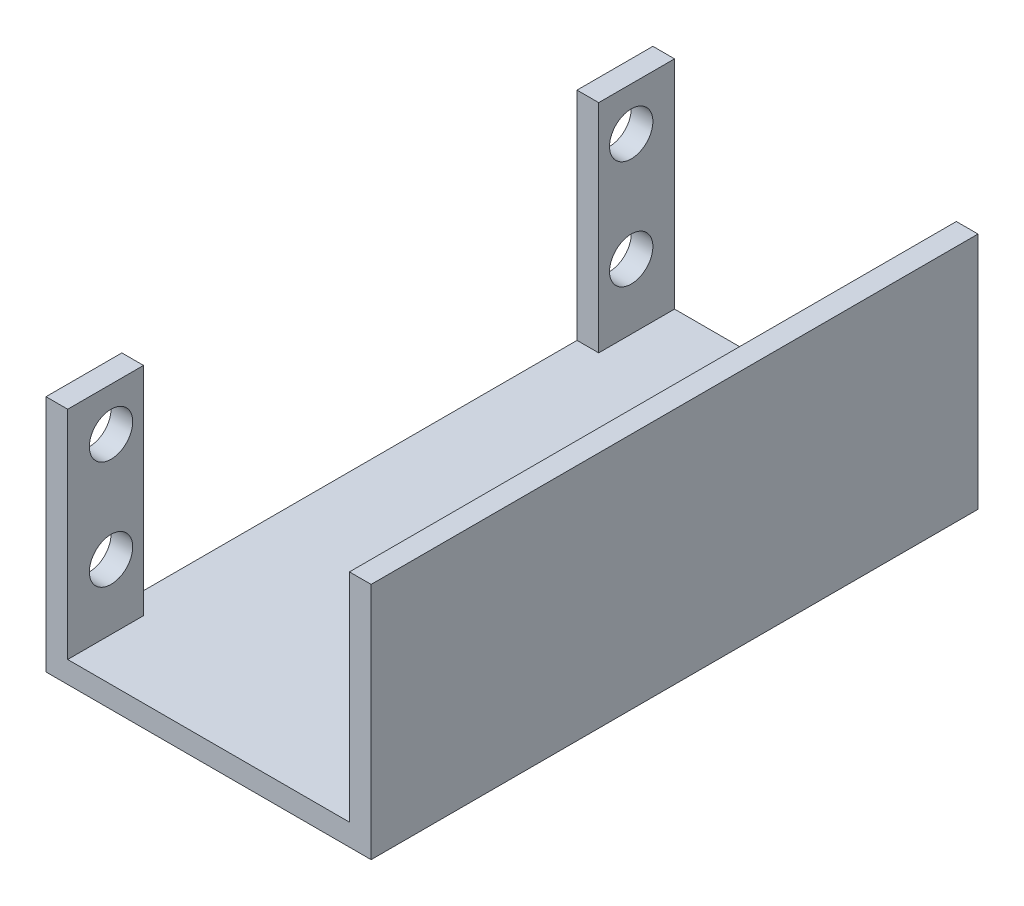
ISO-10303-21;
HEADER;
FILE_DESCRIPTION(('STEP AP214'),'2;1');
FILE_NAME('part.step','',(''),(''),'','','');
FILE_SCHEMA(('AUTOMOTIVE_DESIGN { 1 0 10303 214 1 1 1 1 }'));
ENDSEC;
DATA;
#1=APPLICATION_CONTEXT('core data for automotive mechanical design processes');
#2=APPLICATION_PROTOCOL_DEFINITION('international standard','automotive_design',2000,#1);
#3=PRODUCT_CONTEXT('',#1,'mechanical');
#4=PRODUCT('Part','Part','',(#3));
#5=PRODUCT_RELATED_PRODUCT_CATEGORY('part','',(#4));
#6=PRODUCT_DEFINITION_FORMATION('','',#4);
#7=PRODUCT_DEFINITION_CONTEXT('part definition',#1,'design');
#8=PRODUCT_DEFINITION('design','',#6,#7);
#9=PRODUCT_DEFINITION_SHAPE('','',#8);
#10=(LENGTH_UNIT() NAMED_UNIT(*) SI_UNIT(.MILLI.,.METRE.));
#11=(NAMED_UNIT(*) PLANE_ANGLE_UNIT() SI_UNIT($,.RADIAN.));
#12=(NAMED_UNIT(*) SI_UNIT($,.STERADIAN.) SOLID_ANGLE_UNIT());
#13=UNCERTAINTY_MEASURE_WITH_UNIT(LENGTH_MEASURE(1.E-05),#10,'distance_accuracy_value','');
#14=(GEOMETRIC_REPRESENTATION_CONTEXT(3) GLOBAL_UNCERTAINTY_ASSIGNED_CONTEXT((#13)) GLOBAL_UNIT_ASSIGNED_CONTEXT((#10,
#11,#12)) REPRESENTATION_CONTEXT('',''));
#15=CARTESIAN_POINT('',(0.,0.,0.));
#16=DIRECTION('',(0.,0.,1.));
#17=DIRECTION('',(1.,0.,0.));
#18=AXIS2_PLACEMENT_3D('',#15,#16,#17);
#19=CARTESIAN_POINT('',(-13.,0.,28.));
#20=DIRECTION('',(-1.,0.,0.));
#21=DIRECTION('',(0.,0.,1.));
#22=AXIS2_PLACEMENT_3D('',#19,#20,#21);
#23=PLANE('',#22);
#24=CARTESIAN_POINT('',(-13.,7.,24.));
#25=DIRECTION('',(-1.,0.,0.));
#26=DIRECTION('',(0.,0.,1.));
#27=AXIS2_PLACEMENT_3D('',#24,#25,#26);
#28=CIRCLE('',#27,2.);
#29=CARTESIAN_POINT('',(-13.,7.,26.));
#30=VERTEX_POINT('',#29);
#31=EDGE_CURVE('E239',#30,#30,#28,.F.);
#32=ORIENTED_EDGE('',*,*,#31,.F.);
#33=EDGE_LOOP('',(#32));
#34=FACE_BOUND('',#33,.T.);
#35=CARTESIAN_POINT('',(-13.,17.,24.));
#36=DIRECTION('',(-1.,0.,0.));
#37=DIRECTION('',(0.,0.,1.));
#38=AXIS2_PLACEMENT_3D('',#35,#36,#37);
#39=CIRCLE('',#38,2.00000000000001);
#40=CARTESIAN_POINT('',(-13.,17.,26.));
#41=VERTEX_POINT('',#40);
#42=EDGE_CURVE('E233',#41,#41,#39,.F.);
#43=ORIENTED_EDGE('',*,*,#42,.F.);
#44=EDGE_LOOP('',(#43));
#45=FACE_BOUND('',#44,.T.);
#46=DIRECTION('',(0.,0.,-1.));
#47=VECTOR('',#46,1.);
#48=CARTESIAN_POINT('',(-13.,1.,28.));
#49=LINE('',#48,#47);
#50=CARTESIAN_POINT('',(-13.,1.,28.));
#51=VERTEX_POINT('',#50);
#52=CARTESIAN_POINT('',(-13.,1.,21.));
#53=VERTEX_POINT('',#52);
#54=EDGE_CURVE('E118',#51,#53,#49,.T.);
#55=ORIENTED_EDGE('',*,*,#54,.T.);
#56=DIRECTION('',(0.,1.,0.));
#57=VECTOR('',#56,1.);
#58=CARTESIAN_POINT('',(-13.,0.,21.));
#59=LINE('',#58,#57);
#60=CARTESIAN_POINT('',(-13.,21.,21.));
#61=VERTEX_POINT('',#60);
#62=EDGE_CURVE('E154',#53,#61,#59,.T.);
#63=ORIENTED_EDGE('',*,*,#62,.T.);
#64=DIRECTION('',(0.,0.,-1.));
#65=VECTOR('',#64,1.);
#66=CARTESIAN_POINT('',(-13.,21.,28.));
#67=LINE('',#66,#65);
#68=CARTESIAN_POINT('',(-13.,21.,28.));
#69=VERTEX_POINT('',#68);
#70=EDGE_CURVE('E135',#69,#61,#67,.T.);
#71=ORIENTED_EDGE('',*,*,#70,.F.);
#72=DIRECTION('',(0.,1.,0.));
#73=VECTOR('',#72,1.);
#74=CARTESIAN_POINT('',(-13.,0.,28.));
#75=LINE('',#74,#73);
#76=EDGE_CURVE('E133',#51,#69,#75,.T.);
#77=ORIENTED_EDGE('',*,*,#76,.F.);
#78=EDGE_LOOP('',(#55,#63,#71,#77));
#79=FACE_BOUND('',#78,.T.);
#80=ADVANCED_FACE('F36',(#34,#45,#79),#23,.F.);
#81=CARTESIAN_POINT('',(0.,21.,28.));
#82=DIRECTION('',(0.,1.,0.));
#83=DIRECTION('',(0.,0.,1.));
#84=AXIS2_PLACEMENT_3D('',#81,#82,#83);
#85=PLANE('',#84);
#86=DIRECTION('',(1.,0.,0.));
#87=VECTOR('',#86,1.);
#88=CARTESIAN_POINT('',(-15.,21.,21.));
#89=LINE('',#88,#87);
#90=CARTESIAN_POINT('',(-15.,21.,21.));
#91=VERTEX_POINT('',#90);
#92=EDGE_CURVE('E207',#91,#61,#89,.T.);
#93=ORIENTED_EDGE('',*,*,#92,.F.);
#94=DIRECTION('',(0.,0.,-1.));
#95=VECTOR('',#94,1.);
#96=CARTESIAN_POINT('',(-15.,21.,28.));
#97=LINE('',#96,#95);
#98=CARTESIAN_POINT('',(-15.,21.,28.));
#99=VERTEX_POINT('',#98);
#100=EDGE_CURVE('E60',#99,#91,#97,.T.);
#101=ORIENTED_EDGE('',*,*,#100,.F.);
#102=DIRECTION('',(1.,0.,0.));
#103=VECTOR('',#102,1.);
#104=CARTESIAN_POINT('',(0.,21.,28.));
#105=LINE('',#104,#103);
#106=EDGE_CURVE('E138',#99,#69,#105,.T.);
#107=ORIENTED_EDGE('',*,*,#106,.T.);
#108=ORIENTED_EDGE('',*,*,#70,.T.);
#109=EDGE_LOOP('',(#93,#101,#107,#108));
#110=FACE_BOUND('',#109,.T.);
#111=ADVANCED_FACE('F254',(#110),#85,.T.);
#112=CARTESIAN_POINT('',(-15.,0.,28.));
#113=DIRECTION('',(-1.,0.,0.));
#114=DIRECTION('',(0.,0.,1.));
#115=AXIS2_PLACEMENT_3D('',#112,#113,#114);
#116=PLANE('',#115);
#117=CARTESIAN_POINT('',(-15.,7.,-24.));
#118=DIRECTION('',(-1.,0.,0.));
#119=DIRECTION('',(0.,0.,1.));
#120=AXIS2_PLACEMENT_3D('',#117,#118,#119);
#121=CIRCLE('',#120,2.);
#122=CARTESIAN_POINT('',(-15.,7.,-22.));
#123=VERTEX_POINT('',#122);
#124=EDGE_CURVE('E242',#123,#123,#121,.T.);
#125=ORIENTED_EDGE('',*,*,#124,.F.);
#126=EDGE_LOOP('',(#125));
#127=FACE_BOUND('',#126,.T.);
#128=CARTESIAN_POINT('',(-15.,7.,24.));
#129=DIRECTION('',(-1.,0.,0.));
#130=DIRECTION('',(0.,0.,-1.));
#131=AXIS2_PLACEMENT_3D('',#128,#129,#130);
#132=CIRCLE('',#131,2.);
#133=CARTESIAN_POINT('',(-15.,7.,22.));
#134=VERTEX_POINT('',#133);
#135=EDGE_CURVE('E236',#134,#134,#132,.T.);
#136=ORIENTED_EDGE('',*,*,#135,.F.);
#137=EDGE_LOOP('',(#136));
#138=FACE_BOUND('',#137,.T.);
#139=CARTESIAN_POINT('',(-15.,17.,24.));
#140=DIRECTION('',(-1.,0.,0.));
#141=DIRECTION('',(0.,0.,-1.));
#142=AXIS2_PLACEMENT_3D('',#139,#140,#141);
#143=CIRCLE('',#142,2.00000000000001);
#144=CARTESIAN_POINT('',(-15.,17.,22.));
#145=VERTEX_POINT('',#144);
#146=EDGE_CURVE('E230',#145,#145,#143,.T.);
#147=ORIENTED_EDGE('',*,*,#146,.F.);
#148=EDGE_LOOP('',(#147));
#149=FACE_BOUND('',#148,.T.);
#150=CARTESIAN_POINT('',(-15.,17.,-24.));
#151=DIRECTION('',(-1.,0.,0.));
#152=DIRECTION('',(0.,0.,1.));
#153=AXIS2_PLACEMENT_3D('',#150,#151,#152);
#154=CIRCLE('',#153,2.00000000000001);
#155=CARTESIAN_POINT('',(-15.,17.,-22.));
#156=VERTEX_POINT('',#155);
#157=EDGE_CURVE('E226',#156,#156,#154,.T.);
#158=ORIENTED_EDGE('',*,*,#157,.F.);
#159=EDGE_LOOP('',(#158));
#160=FACE_BOUND('',#159,.T.);
#161=DIRECTION('',(0.,-1.,0.));
#162=VECTOR('',#161,1.);
#163=CARTESIAN_POINT('',(-15.,21.,21.));
#164=LINE('',#163,#162);
#165=CARTESIAN_POINT('',(-15.,1.,21.));
#166=VERTEX_POINT('',#165);
#167=EDGE_CURVE('E220',#91,#166,#164,.T.);
#168=ORIENTED_EDGE('',*,*,#167,.T.);
#169=DIRECTION('',(0.,0.,-1.));
#170=VECTOR('',#169,1.);
#171=CARTESIAN_POINT('',(-15.,1.,21.));
#172=LINE('',#171,#170);
#173=CARTESIAN_POINT('',(-15.,1.,-21.));
#174=VERTEX_POINT('',#173);
#175=EDGE_CURVE('E217',#166,#174,#172,.T.);
#176=ORIENTED_EDGE('',*,*,#175,.T.);
#177=DIRECTION('',(0.,1.,0.));
#178=VECTOR('',#177,1.);
#179=CARTESIAN_POINT('',(-15.,21.,-21.));
#180=LINE('',#179,#178);
#181=CARTESIAN_POINT('',(-15.,21.,-21.));
#182=VERTEX_POINT('',#181);
#183=EDGE_CURVE('E210',#174,#182,#180,.T.);
#184=ORIENTED_EDGE('',*,*,#183,.T.);
#185=CARTESIAN_POINT('',(-15.,21.,-28.));
#186=VERTEX_POINT('',#185);
#187=EDGE_CURVE('E94',#182,#186,#97,.T.);
#188=ORIENTED_EDGE('',*,*,#187,.T.);
#189=DIRECTION('',(0.,1.,0.));
#190=VECTOR('',#189,1.);
#191=CARTESIAN_POINT('',(-15.,0.,-28.));
#192=LINE('',#191,#190);
#193=CARTESIAN_POINT('',(-15.,-1.,-28.));
#194=VERTEX_POINT('',#193);
#195=EDGE_CURVE('E151',#194,#186,#192,.T.);
#196=ORIENTED_EDGE('',*,*,#195,.F.);
#197=DIRECTION('',(0.,0.,-1.));
#198=VECTOR('',#197,1.);
#199=CARTESIAN_POINT('',(-15.,-1.,28.));
#200=LINE('',#199,#198);
#201=CARTESIAN_POINT('',(-15.,-1.,28.));
#202=VERTEX_POINT('',#201);
#203=EDGE_CURVE('E11',#202,#194,#200,.T.);
#204=ORIENTED_EDGE('',*,*,#203,.F.);
#205=DIRECTION('',(0.,1.,0.));
#206=VECTOR('',#205,1.);
#207=CARTESIAN_POINT('',(-15.,0.,28.));
#208=LINE('',#207,#206);
#209=EDGE_CURVE('E173',#202,#99,#208,.T.);
#210=ORIENTED_EDGE('',*,*,#209,.T.);
#211=ORIENTED_EDGE('',*,*,#100,.T.);
#212=EDGE_LOOP('',(#168,#176,#184,#188,#196,#204,#210,#211));
#213=FACE_BOUND('',#212,.T.);
#214=ADVANCED_FACE('F38',(#127,#138,#149,#160,#213),#116,.T.);
#215=CARTESIAN_POINT('',(0.,-1.,28.));
#216=DIRECTION('',(0.,1.,0.));
#217=DIRECTION('',(0.,0.,1.));
#218=AXIS2_PLACEMENT_3D('',#215,#216,#217);
#219=PLANE('',#218);
#220=DIRECTION('',(1.,0.,0.));
#221=VECTOR('',#220,1.);
#222=CARTESIAN_POINT('',(0.,-1.,-28.));
#223=LINE('',#222,#221);
#224=CARTESIAN_POINT('',(15.,-1.,-28.));
#225=VERTEX_POINT('',#224);
#226=EDGE_CURVE('E153',#194,#225,#223,.T.);
#227=ORIENTED_EDGE('',*,*,#226,.T.);
#228=DIRECTION('',(0.,0.,-1.));
#229=VECTOR('',#228,1.);
#230=CARTESIAN_POINT('',(15.,-1.,28.));
#231=LINE('',#230,#229);
#232=CARTESIAN_POINT('',(15.,-1.,28.));
#233=VERTEX_POINT('',#232);
#234=EDGE_CURVE('E44',#233,#225,#231,.T.);
#235=ORIENTED_EDGE('',*,*,#234,.F.);
#236=DIRECTION('',(1.,0.,0.));
#237=VECTOR('',#236,1.);
#238=CARTESIAN_POINT('',(0.,-1.,28.));
#239=LINE('',#238,#237);
#240=EDGE_CURVE('E200',#202,#233,#239,.T.);
#241=ORIENTED_EDGE('',*,*,#240,.F.);
#242=ORIENTED_EDGE('',*,*,#203,.T.);
#243=EDGE_LOOP('',(#227,#235,#241,#242));
#244=FACE_BOUND('',#243,.T.);
#245=ADVANCED_FACE('F253',(#244),#219,.F.);
#246=CARTESIAN_POINT('',(15.,0.,28.));
#247=DIRECTION('',(-1.,0.,0.));
#248=DIRECTION('',(0.,0.,1.));
#249=AXIS2_PLACEMENT_3D('',#246,#247,#248);
#250=PLANE('',#249);
#251=DIRECTION('',(0.,1.,0.));
#252=VECTOR('',#251,1.);
#253=CARTESIAN_POINT('',(15.,0.,-28.));
#254=LINE('',#253,#252);
#255=CARTESIAN_POINT('',(15.,21.,-28.));
#256=VERTEX_POINT('',#255);
#257=EDGE_CURVE('E156',#225,#256,#254,.T.);
#258=ORIENTED_EDGE('',*,*,#257,.T.);
#259=DIRECTION('',(0.,0.,-1.));
#260=VECTOR('',#259,1.);
#261=CARTESIAN_POINT('',(15.,21.,28.));
#262=LINE('',#261,#260);
#263=CARTESIAN_POINT('',(15.,21.,28.));
#264=VERTEX_POINT('',#263);
#265=EDGE_CURVE('E180',#264,#256,#262,.T.);
#266=ORIENTED_EDGE('',*,*,#265,.F.);
#267=DIRECTION('',(0.,1.,0.));
#268=VECTOR('',#267,1.);
#269=CARTESIAN_POINT('',(15.,0.,28.));
#270=LINE('',#269,#268);
#271=EDGE_CURVE('E189',#233,#264,#270,.T.);
#272=ORIENTED_EDGE('',*,*,#271,.F.);
#273=ORIENTED_EDGE('',*,*,#234,.T.);
#274=EDGE_LOOP('',(#258,#266,#272,#273));
#275=FACE_BOUND('',#274,.T.);
#276=ADVANCED_FACE('F187',(#275),#250,.F.);
#277=CARTESIAN_POINT('',(0.,21.,28.));
#278=DIRECTION('',(0.,-1.,0.));
#279=DIRECTION('',(0.,0.,-1.));
#280=AXIS2_PLACEMENT_3D('',#277,#278,#279);
#281=PLANE('',#280);
#282=DIRECTION('',(-1.,0.,0.));
#283=VECTOR('',#282,1.);
#284=CARTESIAN_POINT('',(0.,21.,-28.));
#285=LINE('',#284,#283);
#286=CARTESIAN_POINT('',(13.,21.,-28.));
#287=VERTEX_POINT('',#286);
#288=EDGE_CURVE('E158',#256,#287,#285,.T.);
#289=ORIENTED_EDGE('',*,*,#288,.T.);
#290=DIRECTION('',(0.,0.,-1.));
#291=VECTOR('',#290,1.);
#292=CARTESIAN_POINT('',(13.,21.,28.));
#293=LINE('',#292,#291);
#294=CARTESIAN_POINT('',(13.,21.,28.));
#295=VERTEX_POINT('',#294);
#296=EDGE_CURVE('E178',#295,#287,#293,.T.);
#297=ORIENTED_EDGE('',*,*,#296,.F.);
#298=DIRECTION('',(-1.,0.,0.));
#299=VECTOR('',#298,1.);
#300=CARTESIAN_POINT('',(0.,21.,28.));
#301=LINE('',#300,#299);
#302=EDGE_CURVE('E146',#264,#295,#301,.T.);
#303=ORIENTED_EDGE('',*,*,#302,.F.);
#304=ORIENTED_EDGE('',*,*,#265,.T.);
#305=EDGE_LOOP('',(#289,#297,#303,#304));
#306=FACE_BOUND('',#305,.T.);
#307=ADVANCED_FACE('F198',(#306),#281,.F.);
#308=CARTESIAN_POINT('',(13.,0.,28.));
#309=DIRECTION('',(-1.,0.,0.));
#310=DIRECTION('',(0.,0.,1.));
#311=AXIS2_PLACEMENT_3D('',#308,#309,#310);
#312=PLANE('',#311);
#313=DIRECTION('',(0.,1.,0.));
#314=VECTOR('',#313,1.);
#315=CARTESIAN_POINT('',(13.,0.,-28.));
#316=LINE('',#315,#314);
#317=CARTESIAN_POINT('',(13.,1.,-28.));
#318=VERTEX_POINT('',#317);
#319=EDGE_CURVE('E161',#318,#287,#316,.T.);
#320=ORIENTED_EDGE('',*,*,#319,.F.);
#321=DIRECTION('',(0.,0.,-1.));
#322=VECTOR('',#321,1.);
#323=CARTESIAN_POINT('',(13.,1.,28.));
#324=LINE('',#323,#322);
#325=CARTESIAN_POINT('',(13.,1.,28.));
#326=VERTEX_POINT('',#325);
#327=EDGE_CURVE('E129',#326,#318,#324,.T.);
#328=ORIENTED_EDGE('',*,*,#327,.F.);
#329=DIRECTION('',(0.,1.,0.));
#330=VECTOR('',#329,1.);
#331=CARTESIAN_POINT('',(13.,0.,28.));
#332=LINE('',#331,#330);
#333=EDGE_CURVE('E144',#326,#295,#332,.T.);
#334=ORIENTED_EDGE('',*,*,#333,.T.);
#335=ORIENTED_EDGE('',*,*,#296,.T.);
#336=EDGE_LOOP('',(#320,#328,#334,#335));
#337=FACE_BOUND('',#336,.T.);
#338=ADVANCED_FACE('F286',(#337),#312,.T.);
#339=CARTESIAN_POINT('',(0.,1.,28.));
#340=DIRECTION('',(0.,1.,0.));
#341=DIRECTION('',(0.,0.,1.));
#342=AXIS2_PLACEMENT_3D('',#339,#340,#341);
#343=PLANE('',#342);
#344=CARTESIAN_POINT('',(-13.,1.,-21.));
#345=VERTEX_POINT('',#344);
#346=CARTESIAN_POINT('',(-13.,1.,-28.));
#347=VERTEX_POINT('',#346);
#348=EDGE_CURVE('E130',#345,#347,#49,.T.);
#349=ORIENTED_EDGE('',*,*,#348,.F.);
#350=DIRECTION('',(1.,0.,0.));
#351=VECTOR('',#350,1.);
#352=CARTESIAN_POINT('',(-15.,1.,-21.));
#353=LINE('',#352,#351);
#354=EDGE_CURVE('E209',#174,#345,#353,.T.);
#355=ORIENTED_EDGE('',*,*,#354,.F.);
#356=ORIENTED_EDGE('',*,*,#175,.F.);
#357=DIRECTION('',(1.,0.,0.));
#358=VECTOR('',#357,1.);
#359=CARTESIAN_POINT('',(-15.,1.,21.));
#360=LINE('',#359,#358);
#361=EDGE_CURVE('E126',#166,#53,#360,.T.);
#362=ORIENTED_EDGE('',*,*,#361,.T.);
#363=ORIENTED_EDGE('',*,*,#54,.F.);
#364=DIRECTION('',(1.,0.,0.));
#365=VECTOR('',#364,1.);
#366=CARTESIAN_POINT('',(0.,1.,28.));
#367=LINE('',#366,#365);
#368=EDGE_CURVE('E123',#51,#326,#367,.T.);
#369=ORIENTED_EDGE('',*,*,#368,.T.);
#370=ORIENTED_EDGE('',*,*,#327,.T.);
#371=DIRECTION('',(1.,0.,0.));
#372=VECTOR('',#371,1.);
#373=CARTESIAN_POINT('',(0.,1.,-28.));
#374=LINE('',#373,#372);
#375=EDGE_CURVE('E164',#347,#318,#374,.T.);
#376=ORIENTED_EDGE('',*,*,#375,.F.);
#377=EDGE_LOOP('',(#349,#355,#356,#362,#363,#369,#370,#376));
#378=FACE_BOUND('',#377,.T.);
#379=ADVANCED_FACE('F121',(#378),#343,.T.);
#380=CARTESIAN_POINT('',(-13.,7.,-24.));
#381=DIRECTION('',(-1.,0.,0.));
#382=DIRECTION('',(0.,0.,1.));
#383=AXIS2_PLACEMENT_3D('',#380,#381,#382);
#384=CIRCLE('',#383,2.);
#385=CARTESIAN_POINT('',(-13.,7.,-22.));
#386=VERTEX_POINT('',#385);
#387=EDGE_CURVE('E229',#386,#386,#384,.F.);
#388=ORIENTED_EDGE('',*,*,#387,.F.);
#389=EDGE_LOOP('',(#388));
#390=FACE_BOUND('',#389,.T.);
#391=CARTESIAN_POINT('',(-13.,17.,-24.));
#392=DIRECTION('',(-1.,0.,0.));
#393=DIRECTION('',(0.,0.,1.));
#394=AXIS2_PLACEMENT_3D('',#391,#392,#393);
#395=CIRCLE('',#394,2.00000000000001);
#396=CARTESIAN_POINT('',(-13.,17.,-22.));
#397=VERTEX_POINT('',#396);
#398=EDGE_CURVE('E223',#397,#397,#395,.F.);
#399=ORIENTED_EDGE('',*,*,#398,.F.);
#400=EDGE_LOOP('',(#399));
#401=FACE_BOUND('',#400,.T.);
#402=CARTESIAN_POINT('',(-13.,21.,-21.));
#403=VERTEX_POINT('',#402);
#404=CARTESIAN_POINT('',(-13.,21.,-28.));
#405=VERTEX_POINT('',#404);
#406=EDGE_CURVE('E175',#403,#405,#67,.T.);
#407=ORIENTED_EDGE('',*,*,#406,.F.);
#408=DIRECTION('',(0.,-1.,0.));
#409=VECTOR('',#408,1.);
#410=CARTESIAN_POINT('',(-13.,0.,-21.));
#411=LINE('',#410,#409);
#412=EDGE_CURVE('E51',#403,#345,#411,.T.);
#413=ORIENTED_EDGE('',*,*,#412,.T.);
#414=ORIENTED_EDGE('',*,*,#348,.T.);
#415=DIRECTION('',(0.,1.,0.));
#416=VECTOR('',#415,1.);
#417=CARTESIAN_POINT('',(-13.,0.,-28.));
#418=LINE('',#417,#416);
#419=EDGE_CURVE('E167',#347,#405,#418,.T.);
#420=ORIENTED_EDGE('',*,*,#419,.T.);
#421=EDGE_LOOP('',(#407,#413,#414,#420));
#422=FACE_BOUND('',#421,.T.);
#423=ADVANCED_FACE('F293',(#390,#401,#422),#23,.F.);
#424=DIRECTION('',(1.,0.,0.));
#425=VECTOR('',#424,1.);
#426=CARTESIAN_POINT('',(-15.,21.,-21.));
#427=LINE('',#426,#425);
#428=EDGE_CURVE('E212',#182,#403,#427,.T.);
#429=ORIENTED_EDGE('',*,*,#428,.T.);
#430=ORIENTED_EDGE('',*,*,#406,.T.);
#431=DIRECTION('',(1.,0.,0.));
#432=VECTOR('',#431,1.);
#433=CARTESIAN_POINT('',(0.,21.,-28.));
#434=LINE('',#433,#432);
#435=EDGE_CURVE('E170',#186,#405,#434,.T.);
#436=ORIENTED_EDGE('',*,*,#435,.F.);
#437=ORIENTED_EDGE('',*,*,#187,.F.);
#438=EDGE_LOOP('',(#429,#430,#436,#437));
#439=FACE_BOUND('',#438,.T.);
#440=ADVANCED_FACE('F281',(#439),#85,.T.);
#441=CARTESIAN_POINT('',(0.,0.,28.));
#442=DIRECTION('',(0.,0.,1.));
#443=DIRECTION('',(1.,0.,0.));
#444=AXIS2_PLACEMENT_3D('',#441,#442,#443);
#445=PLANE('',#444);
#446=ORIENTED_EDGE('',*,*,#209,.F.);
#447=ORIENTED_EDGE('',*,*,#240,.T.);
#448=ORIENTED_EDGE('',*,*,#271,.T.);
#449=ORIENTED_EDGE('',*,*,#302,.T.);
#450=ORIENTED_EDGE('',*,*,#333,.F.);
#451=ORIENTED_EDGE('',*,*,#368,.F.);
#452=ORIENTED_EDGE('',*,*,#76,.T.);
#453=ORIENTED_EDGE('',*,*,#106,.F.);
#454=EDGE_LOOP('',(#446,#447,#448,#449,#450,#451,#452,#453));
#455=FACE_BOUND('',#454,.T.);
#456=ADVANCED_FACE('F142',(#455),#445,.T.);
#457=CARTESIAN_POINT('',(0.,0.,-28.));
#458=DIRECTION('',(0.,0.,1.));
#459=DIRECTION('',(1.,0.,0.));
#460=AXIS2_PLACEMENT_3D('',#457,#458,#459);
#461=PLANE('',#460);
#462=ORIENTED_EDGE('',*,*,#195,.T.);
#463=ORIENTED_EDGE('',*,*,#435,.T.);
#464=ORIENTED_EDGE('',*,*,#419,.F.);
#465=ORIENTED_EDGE('',*,*,#375,.T.);
#466=ORIENTED_EDGE('',*,*,#319,.T.);
#467=ORIENTED_EDGE('',*,*,#288,.F.);
#468=ORIENTED_EDGE('',*,*,#257,.F.);
#469=ORIENTED_EDGE('',*,*,#226,.F.);
#470=EDGE_LOOP('',(#462,#463,#464,#465,#466,#467,#468,#469));
#471=FACE_BOUND('',#470,.T.);
#472=ADVANCED_FACE('F194',(#471),#461,.F.);
#473=CARTESIAN_POINT('',(-15.,21.,21.));
#474=DIRECTION('',(0.,0.,1.));
#475=DIRECTION('',(1.,0.,0.));
#476=AXIS2_PLACEMENT_3D('',#473,#474,#475);
#477=PLANE('',#476);
#478=ORIENTED_EDGE('',*,*,#361,.F.);
#479=ORIENTED_EDGE('',*,*,#167,.F.);
#480=ORIENTED_EDGE('',*,*,#92,.T.);
#481=ORIENTED_EDGE('',*,*,#62,.F.);
#482=EDGE_LOOP('',(#478,#479,#480,#481));
#483=FACE_BOUND('',#482,.T.);
#484=ADVANCED_FACE('F266',(#483),#477,.F.);
#485=CARTESIAN_POINT('',(-15.,21.,-21.));
#486=DIRECTION('',(0.,0.,-1.));
#487=DIRECTION('',(-1.,0.,0.));
#488=AXIS2_PLACEMENT_3D('',#485,#486,#487);
#489=PLANE('',#488);
#490=ORIENTED_EDGE('',*,*,#428,.F.);
#491=ORIENTED_EDGE('',*,*,#183,.F.);
#492=ORIENTED_EDGE('',*,*,#354,.T.);
#493=ORIENTED_EDGE('',*,*,#412,.F.);
#494=EDGE_LOOP('',(#490,#491,#492,#493));
#495=FACE_BOUND('',#494,.T.);
#496=ADVANCED_FACE('F278',(#495),#489,.F.);
#497=CARTESIAN_POINT('',(15.001,17.,-24.));
#498=DIRECTION('',(-1.,0.,0.));
#499=DIRECTION('',(0.,0.,1.));
#500=AXIS2_PLACEMENT_3D('',#497,#498,#499);
#501=CYLINDRICAL_SURFACE('',#500,2.00000000000001);
#502=ORIENTED_EDGE('',*,*,#157,.T.);
#503=EDGE_LOOP('',(#502));
#504=FACE_BOUND('',#503,.T.);
#505=ORIENTED_EDGE('',*,*,#398,.T.);
#506=EDGE_LOOP('',(#505));
#507=FACE_BOUND('',#506,.T.);
#508=ADVANCED_FACE('F314',(#504,#507),#501,.F.);
#509=CARTESIAN_POINT('',(15.001,7.,-24.));
#510=DIRECTION('',(-1.,0.,0.));
#511=DIRECTION('',(0.,0.,1.));
#512=AXIS2_PLACEMENT_3D('',#509,#510,#511);
#513=CYLINDRICAL_SURFACE('',#512,2.);
#514=ORIENTED_EDGE('',*,*,#124,.T.);
#515=EDGE_LOOP('',(#514));
#516=FACE_BOUND('',#515,.T.);
#517=ORIENTED_EDGE('',*,*,#387,.T.);
#518=EDGE_LOOP('',(#517));
#519=FACE_BOUND('',#518,.T.);
#520=ADVANCED_FACE('F248',(#516,#519),#513,.F.);
#521=CARTESIAN_POINT('',(15.001,17.,24.));
#522=DIRECTION('',(-1.,0.,0.));
#523=DIRECTION('',(0.,0.,1.));
#524=AXIS2_PLACEMENT_3D('',#521,#522,#523);
#525=CYLINDRICAL_SURFACE('',#524,2.00000000000001);
#526=ORIENTED_EDGE('',*,*,#146,.T.);
#527=EDGE_LOOP('',(#526));
#528=FACE_BOUND('',#527,.T.);
#529=ORIENTED_EDGE('',*,*,#42,.T.);
#530=EDGE_LOOP('',(#529));
#531=FACE_BOUND('',#530,.T.);
#532=ADVANCED_FACE('F322',(#528,#531),#525,.F.);
#533=CARTESIAN_POINT('',(15.001,7.,24.));
#534=DIRECTION('',(-1.,0.,0.));
#535=DIRECTION('',(0.,0.,1.));
#536=AXIS2_PLACEMENT_3D('',#533,#534,#535);
#537=CYLINDRICAL_SURFACE('',#536,2.);
#538=ORIENTED_EDGE('',*,*,#135,.T.);
#539=EDGE_LOOP('',(#538));
#540=FACE_BOUND('',#539,.T.);
#541=ORIENTED_EDGE('',*,*,#31,.T.);
#542=EDGE_LOOP('',(#541));
#543=FACE_BOUND('',#542,.T.);
#544=ADVANCED_FACE('F387',(#540,#543),#537,.F.);
#545=CLOSED_SHELL('',(#80,#111,#214,#245,#276,#307,#338,#379,#423,#440,#456,#472,#484,#496,#508,
#520,#532,#544));
#546=MANIFOLD_SOLID_BREP('B2',#545);
#547=ADVANCED_BREP_SHAPE_REPRESENTATION('',(#18,#546),#14);
#548=SHAPE_DEFINITION_REPRESENTATION(#9,#547);
ENDSEC;
END-ISO-10303-21;
